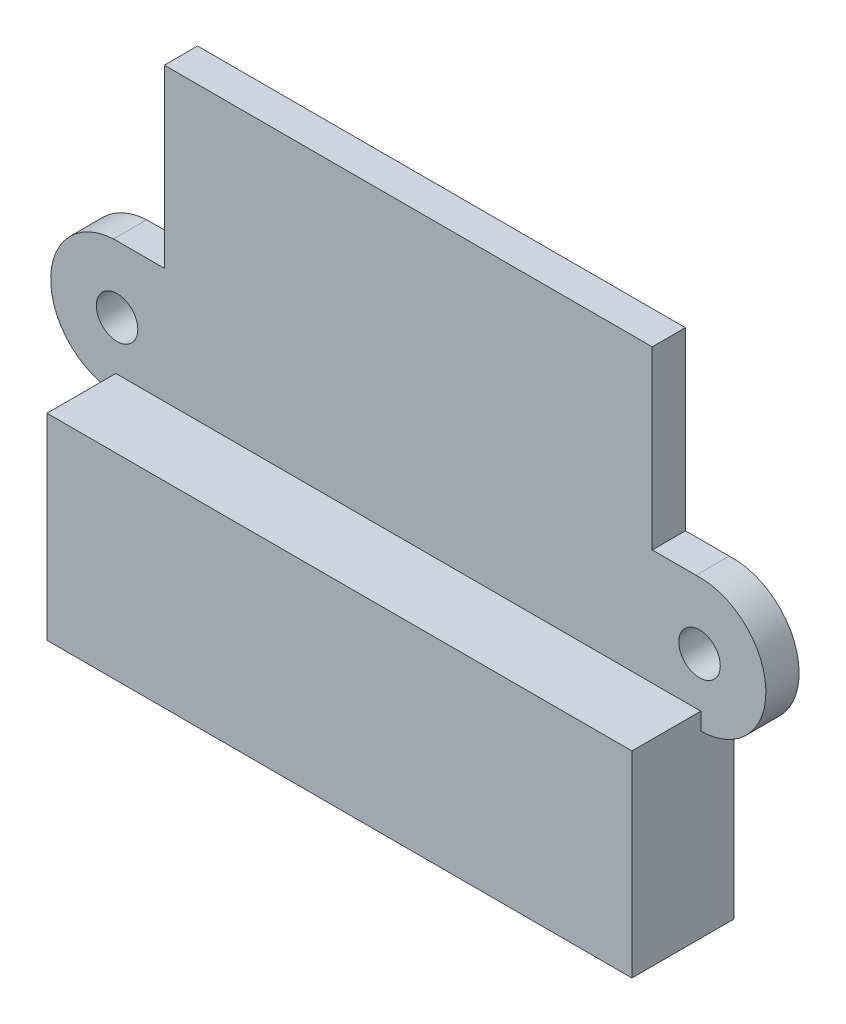
ISO-10303-21;
HEADER;
FILE_DESCRIPTION(('STEP AP214'),'2;1');
FILE_NAME('part.step','',(''),(''),'','','');
FILE_SCHEMA(('AUTOMOTIVE_DESIGN { 1 0 10303 214 1 1 1 1 }'));
ENDSEC;
DATA;
#1=APPLICATION_CONTEXT('core data for automotive mechanical design processes');
#2=APPLICATION_PROTOCOL_DEFINITION('international standard','automotive_design',2000,#1);
#3=PRODUCT_CONTEXT('',#1,'mechanical');
#4=PRODUCT('Part','Part','',(#3));
#5=PRODUCT_RELATED_PRODUCT_CATEGORY('part','',(#4));
#6=PRODUCT_DEFINITION_FORMATION('','',#4);
#7=PRODUCT_DEFINITION_CONTEXT('part definition',#1,'design');
#8=PRODUCT_DEFINITION('design','',#6,#7);
#9=PRODUCT_DEFINITION_SHAPE('','',#8);
#10=(LENGTH_UNIT() NAMED_UNIT(*) SI_UNIT(.MILLI.,.METRE.));
#11=(NAMED_UNIT(*) PLANE_ANGLE_UNIT() SI_UNIT($,.RADIAN.));
#12=(NAMED_UNIT(*) SI_UNIT($,.STERADIAN.) SOLID_ANGLE_UNIT());
#13=UNCERTAINTY_MEASURE_WITH_UNIT(LENGTH_MEASURE(1.E-05),#10,'distance_accuracy_value','');
#14=(GEOMETRIC_REPRESENTATION_CONTEXT(3) GLOBAL_UNCERTAINTY_ASSIGNED_CONTEXT((#13)) GLOBAL_UNIT_ASSIGNED_CONTEXT((#10,
#11,#12)) REPRESENTATION_CONTEXT('',''));
#15=CARTESIAN_POINT('',(0.,0.,0.));
#16=DIRECTION('',(0.,0.,1.));
#17=DIRECTION('',(1.,0.,0.));
#18=AXIS2_PLACEMENT_3D('',#15,#16,#17);
#19=CARTESIAN_POINT('',(8.9154,0.0536072783052845,1.016));
#20=DIRECTION('',(0.,0.,1.));
#21=DIRECTION('',(1.,0.,0.));
#22=AXIS2_PLACEMENT_3D('',#19,#20,#21);
#23=PLANE('',#22);
#24=DIRECTION('',(0.,-1.,0.));
#25=VECTOR('',#24,1.);
#26=CARTESIAN_POINT('',(-8.9535,-7.4676,1.016));
#27=LINE('',#26,#25);
#28=CARTESIAN_POINT('',(-8.9535,-1.4478,1.016));
#29=VERTEX_POINT('',#28);
#30=CARTESIAN_POINT('',(-8.9535,-1.97803550279577,1.016));
#31=VERTEX_POINT('',#30);
#32=EDGE_CURVE('E118',#29,#31,#27,.T.);
#33=ORIENTED_EDGE('',*,*,#32,.F.);
#34=DIRECTION('',(-1.,0.,0.));
#35=VECTOR('',#34,1.);
#36=CARTESIAN_POINT('',(-8.9535,-1.4478,1.016));
#37=LINE('',#36,#35);
#38=CARTESIAN_POINT('',(8.9535,-1.4478,1.016));
#39=VERTEX_POINT('',#38);
#40=EDGE_CURVE('E245',#39,#29,#37,.T.);
#41=ORIENTED_EDGE('',*,*,#40,.F.);
#42=DIRECTION('',(0.,1.,0.));
#43=VECTOR('',#42,1.);
#44=CARTESIAN_POINT('',(8.9535,-7.4676,1.016));
#45=LINE('',#44,#43);
#46=CARTESIAN_POINT('',(8.9535,-1.97803550279576,1.016));
#47=VERTEX_POINT('',#46);
#48=EDGE_CURVE('E12',#47,#39,#45,.T.);
#49=ORIENTED_EDGE('',*,*,#48,.F.);
#50=CARTESIAN_POINT('',(8.9154,0.0536072783052845,1.016));
#51=DIRECTION('',(0.,0.,1.));
#52=DIRECTION('',(1.,0.,0.));
#53=AXIS2_PLACEMENT_3D('',#50,#51,#52);
#54=CIRCLE('',#53,2.032);
#55=CARTESIAN_POINT('',(8.80862501125639,2.0828,1.016));
#56=VERTEX_POINT('',#55);
#57=EDGE_CURVE('E211',#47,#56,#54,.T.);
#58=ORIENTED_EDGE('',*,*,#57,.T.);
#59=DIRECTION('',(1.,0.,0.));
#60=VECTOR('',#59,1.);
#61=CARTESIAN_POINT('',(7.4676,2.0828,1.016));
#62=LINE('',#61,#60);
#63=CARTESIAN_POINT('',(7.4676,2.0828,1.016));
#64=VERTEX_POINT('',#63);
#65=EDGE_CURVE('E213',#64,#56,#62,.T.);
#66=ORIENTED_EDGE('',*,*,#65,.F.);
#67=DIRECTION('',(0.,-1.,0.));
#68=VECTOR('',#67,1.);
#69=CARTESIAN_POINT('',(7.4676,7.4676,1.016));
#70=LINE('',#69,#68);
#71=CARTESIAN_POINT('',(7.4676,7.4676,1.016));
#72=VERTEX_POINT('',#71);
#73=EDGE_CURVE('E263',#72,#64,#70,.T.);
#74=ORIENTED_EDGE('',*,*,#73,.F.);
#75=DIRECTION('',(1.,0.,0.));
#76=VECTOR('',#75,1.);
#77=CARTESIAN_POINT('',(-7.4676,7.4676,1.016));
#78=LINE('',#77,#76);
#79=CARTESIAN_POINT('',(-7.4676,7.4676,1.016));
#80=VERTEX_POINT('',#79);
#81=EDGE_CURVE('E261',#80,#72,#78,.T.);
#82=ORIENTED_EDGE('',*,*,#81,.F.);
#83=DIRECTION('',(0.,-1.,0.));
#84=VECTOR('',#83,1.);
#85=CARTESIAN_POINT('',(-7.4676,7.4676,1.016));
#86=LINE('',#85,#84);
#87=CARTESIAN_POINT('',(-7.4676,2.0828,1.016));
#88=VERTEX_POINT('',#87);
#89=EDGE_CURVE('E194',#80,#88,#86,.T.);
#90=ORIENTED_EDGE('',*,*,#89,.T.);
#91=DIRECTION('',(-1.,0.,0.));
#92=VECTOR('',#91,1.);
#93=CARTESIAN_POINT('',(-7.4676,2.0828,1.016));
#94=LINE('',#93,#92);
#95=CARTESIAN_POINT('',(-9.02217498874347,2.0828,1.016));
#96=VERTEX_POINT('',#95);
#97=EDGE_CURVE('E187',#88,#96,#94,.T.);
#98=ORIENTED_EDGE('',*,*,#97,.T.);
#99=CARTESIAN_POINT('',(-8.9154,0.0536072783052823,1.016));
#100=DIRECTION('',(0.,0.,1.));
#101=DIRECTION('',(1.,0.,0.));
#102=AXIS2_PLACEMENT_3D('',#99,#100,#101);
#103=CIRCLE('',#102,2.032);
#104=EDGE_CURVE('E191',#96,#31,#103,.T.);
#105=ORIENTED_EDGE('',*,*,#104,.T.);
#106=EDGE_LOOP('',(#33,#41,#49,#58,#66,#74,#82,#90,#98,#105));
#107=FACE_BOUND('',#106,.T.);
#108=CARTESIAN_POINT('',(-8.9154,0.0536072783052823,1.016));
#109=DIRECTION('',(0.,0.,1.));
#110=DIRECTION('',(1.,0.,0.));
#111=AXIS2_PLACEMENT_3D('',#108,#109,#110);
#112=CIRCLE('',#111,0.635000005703479);
#113=CARTESIAN_POINT('',(-8.28039999429652,0.0536072783052823,1.016));
#114=VERTEX_POINT('',#113);
#115=EDGE_CURVE('E255',#114,#114,#112,.T.);
#116=ORIENTED_EDGE('',*,*,#115,.F.);
#117=EDGE_LOOP('',(#116));
#118=FACE_BOUND('',#117,.T.);
#119=CARTESIAN_POINT('',(8.9154,0.0536072783052845,1.016));
#120=DIRECTION('',(0.,0.,1.));
#121=DIRECTION('',(1.,0.,0.));
#122=AXIS2_PLACEMENT_3D('',#119,#120,#121);
#123=CIRCLE('',#122,0.635000005703479);
#124=CARTESIAN_POINT('',(9.55040000570348,0.0536072783052845,1.016));
#125=VERTEX_POINT('',#124);
#126=EDGE_CURVE('E248',#125,#125,#123,.T.);
#127=ORIENTED_EDGE('',*,*,#126,.F.);
#128=EDGE_LOOP('',(#127));
#129=FACE_BOUND('',#128,.T.);
#130=ADVANCED_FACE('F101',(#107,#118,#129),#23,.T.);
#131=CARTESIAN_POINT('',(8.9154,0.0536072783052845,0.));
#132=DIRECTION('',(0.,0.,1.));
#133=DIRECTION('',(1.,0.,0.));
#134=AXIS2_PLACEMENT_3D('',#131,#132,#133);
#135=PLANE('',#134);
#136=CARTESIAN_POINT('',(-8.9154,0.0536072783052823,0.));
#137=DIRECTION('',(0.,0.,1.));
#138=DIRECTION('',(1.,0.,0.));
#139=AXIS2_PLACEMENT_3D('',#136,#137,#138);
#140=CIRCLE('',#139,0.635000005703479);
#141=CARTESIAN_POINT('',(-8.28039999429652,0.0536072783052823,0.));
#142=VERTEX_POINT('',#141);
#143=EDGE_CURVE('E251',#142,#142,#140,.T.);
#144=ORIENTED_EDGE('',*,*,#143,.T.);
#145=EDGE_LOOP('',(#144));
#146=FACE_BOUND('',#145,.T.);
#147=DIRECTION('',(1.,0.,0.));
#148=VECTOR('',#147,1.);
#149=CARTESIAN_POINT('',(-7.4676,7.4676,0.));
#150=LINE('',#149,#148);
#151=CARTESIAN_POINT('',(-7.4676,7.4676,0.));
#152=VERTEX_POINT('',#151);
#153=CARTESIAN_POINT('',(7.4676,7.4676,0.));
#154=VERTEX_POINT('',#153);
#155=EDGE_CURVE('E258',#152,#154,#150,.T.);
#156=ORIENTED_EDGE('',*,*,#155,.T.);
#157=DIRECTION('',(0.,-1.,0.));
#158=VECTOR('',#157,1.);
#159=CARTESIAN_POINT('',(7.4676,7.4676,0.));
#160=LINE('',#159,#158);
#161=CARTESIAN_POINT('',(7.4676,2.0828,0.));
#162=VERTEX_POINT('',#161);
#163=EDGE_CURVE('E271',#154,#162,#160,.T.);
#164=ORIENTED_EDGE('',*,*,#163,.T.);
#165=DIRECTION('',(1.,0.,0.));
#166=VECTOR('',#165,1.);
#167=CARTESIAN_POINT('',(7.4676,2.0828,0.));
#168=LINE('',#167,#166);
#169=CARTESIAN_POINT('',(8.80862501125639,2.0828,0.));
#170=VERTEX_POINT('',#169);
#171=EDGE_CURVE('E274',#162,#170,#168,.T.);
#172=ORIENTED_EDGE('',*,*,#171,.T.);
#173=CARTESIAN_POINT('',(8.9154,0.0536072783052845,0.));
#174=DIRECTION('',(0.,0.,1.));
#175=DIRECTION('',(1.,0.,0.));
#176=AXIS2_PLACEMENT_3D('',#173,#174,#175);
#177=CIRCLE('',#176,2.032);
#178=CARTESIAN_POINT('',(8.9535,-1.97803550279576,0.));
#179=VERTEX_POINT('',#178);
#180=EDGE_CURVE('E277',#179,#170,#177,.T.);
#181=ORIENTED_EDGE('',*,*,#180,.F.);
#182=DIRECTION('',(0.,-1.,0.));
#183=VECTOR('',#182,1.);
#184=CARTESIAN_POINT('',(8.9535,-1.97803550279576,0.));
#185=LINE('',#184,#183);
#186=CARTESIAN_POINT('',(8.9535,-7.4676,0.));
#187=VERTEX_POINT('',#186);
#188=EDGE_CURVE('E280',#179,#187,#185,.T.);
#189=ORIENTED_EDGE('',*,*,#188,.T.);
#190=DIRECTION('',(1.,0.,0.));
#191=VECTOR('',#190,1.);
#192=CARTESIAN_POINT('',(-8.9535,-7.4676,0.));
#193=LINE('',#192,#191);
#194=CARTESIAN_POINT('',(-8.9535,-7.4676,0.));
#195=VERTEX_POINT('',#194);
#196=EDGE_CURVE('E283',#195,#187,#193,.T.);
#197=ORIENTED_EDGE('',*,*,#196,.F.);
#198=DIRECTION('',(0.,-1.,0.));
#199=VECTOR('',#198,1.);
#200=CARTESIAN_POINT('',(-8.9535,-1.97803550279577,0.));
#201=LINE('',#200,#199);
#202=CARTESIAN_POINT('',(-8.9535,-1.97803550279577,0.));
#203=VERTEX_POINT('',#202);
#204=EDGE_CURVE('E285',#203,#195,#201,.T.);
#205=ORIENTED_EDGE('',*,*,#204,.F.);
#206=CARTESIAN_POINT('',(-8.9154,0.0536072783052823,0.));
#207=DIRECTION('',(0.,0.,1.));
#208=DIRECTION('',(1.,0.,0.));
#209=AXIS2_PLACEMENT_3D('',#206,#207,#208);
#210=CIRCLE('',#209,2.032);
#211=CARTESIAN_POINT('',(-9.02217498874347,2.0828,0.));
#212=VERTEX_POINT('',#211);
#213=EDGE_CURVE('E287',#212,#203,#210,.T.);
#214=ORIENTED_EDGE('',*,*,#213,.F.);
#215=DIRECTION('',(-1.,0.,0.));
#216=VECTOR('',#215,1.);
#217=CARTESIAN_POINT('',(-7.4676,2.0828,0.));
#218=LINE('',#217,#216);
#219=CARTESIAN_POINT('',(-7.4676,2.0828,0.));
#220=VERTEX_POINT('',#219);
#221=EDGE_CURVE('E203',#220,#212,#218,.T.);
#222=ORIENTED_EDGE('',*,*,#221,.F.);
#223=DIRECTION('',(0.,-1.,0.));
#224=VECTOR('',#223,1.);
#225=CARTESIAN_POINT('',(-7.4676,7.4676,0.));
#226=LINE('',#225,#224);
#227=EDGE_CURVE('E264',#152,#220,#226,.T.);
#228=ORIENTED_EDGE('',*,*,#227,.F.);
#229=EDGE_LOOP('',(#156,#164,#172,#181,#189,#197,#205,#214,#222,#228));
#230=FACE_BOUND('',#229,.T.);
#231=CARTESIAN_POINT('',(8.9154,0.0536072783052845,0.));
#232=DIRECTION('',(0.,0.,1.));
#233=DIRECTION('',(1.,0.,0.));
#234=AXIS2_PLACEMENT_3D('',#231,#232,#233);
#235=CIRCLE('',#234,0.635000005703479);
#236=CARTESIAN_POINT('',(9.55040000570348,0.0536072783052845,0.));
#237=VERTEX_POINT('',#236);
#238=EDGE_CURVE('E252',#237,#237,#235,.T.);
#239=ORIENTED_EDGE('',*,*,#238,.T.);
#240=EDGE_LOOP('',(#239));
#241=FACE_BOUND('',#240,.T.);
#242=ADVANCED_FACE('F292',(#146,#230,#241),#135,.F.);
#243=CARTESIAN_POINT('',(-7.4676,7.4676,1.016));
#244=DIRECTION('',(0.,1.,0.));
#245=DIRECTION('',(-1.,0.,0.));
#246=AXIS2_PLACEMENT_3D('',#243,#244,#245);
#247=PLANE('',#246);
#248=ORIENTED_EDGE('',*,*,#155,.F.);
#249=DIRECTION('',(0.,0.,-1.));
#250=VECTOR('',#249,1.);
#251=CARTESIAN_POINT('',(-7.4676,7.4676,1.016));
#252=LINE('',#251,#250);
#253=EDGE_CURVE('E110',#80,#152,#252,.T.);
#254=ORIENTED_EDGE('',*,*,#253,.F.);
#255=ORIENTED_EDGE('',*,*,#81,.T.);
#256=DIRECTION('',(0.,0.,-1.));
#257=VECTOR('',#256,1.);
#258=CARTESIAN_POINT('',(7.4676,7.4676,1.016));
#259=LINE('',#258,#257);
#260=EDGE_CURVE('E170',#72,#154,#259,.T.);
#261=ORIENTED_EDGE('',*,*,#260,.T.);
#262=EDGE_LOOP('',(#248,#254,#255,#261));
#263=FACE_BOUND('',#262,.T.);
#264=ADVANCED_FACE('F103',(#263),#247,.T.);
#265=CARTESIAN_POINT('',(-7.4676,7.4676,1.016));
#266=DIRECTION('',(1.,0.,0.));
#267=DIRECTION('',(0.,1.,0.));
#268=AXIS2_PLACEMENT_3D('',#265,#266,#267);
#269=PLANE('',#268);
#270=ORIENTED_EDGE('',*,*,#227,.T.);
#271=DIRECTION('',(0.,0.,-1.));
#272=VECTOR('',#271,1.);
#273=CARTESIAN_POINT('',(-7.4676,2.0828,1.016));
#274=LINE('',#273,#272);
#275=EDGE_CURVE('E206',#88,#220,#274,.T.);
#276=ORIENTED_EDGE('',*,*,#275,.F.);
#277=ORIENTED_EDGE('',*,*,#89,.F.);
#278=ORIENTED_EDGE('',*,*,#253,.T.);
#279=EDGE_LOOP('',(#270,#276,#277,#278));
#280=FACE_BOUND('',#279,.T.);
#281=ADVANCED_FACE('F343',(#280),#269,.F.);
#282=CARTESIAN_POINT('',(-7.4676,2.0828,1.016));
#283=DIRECTION('',(0.,-1.,0.));
#284=DIRECTION('',(1.,0.,0.));
#285=AXIS2_PLACEMENT_3D('',#282,#283,#284);
#286=PLANE('',#285);
#287=ORIENTED_EDGE('',*,*,#221,.T.);
#288=DIRECTION('',(0.,0.,-1.));
#289=VECTOR('',#288,1.);
#290=CARTESIAN_POINT('',(-9.02217498874347,2.0828,1.016));
#291=LINE('',#290,#289);
#292=EDGE_CURVE('E200',#96,#212,#291,.T.);
#293=ORIENTED_EDGE('',*,*,#292,.F.);
#294=ORIENTED_EDGE('',*,*,#97,.F.);
#295=ORIENTED_EDGE('',*,*,#275,.T.);
#296=EDGE_LOOP('',(#287,#293,#294,#295));
#297=FACE_BOUND('',#296,.T.);
#298=ADVANCED_FACE('F201',(#297),#286,.F.);
#299=CARTESIAN_POINT('',(-8.9154,0.0536072783052823,1.016));
#300=DIRECTION('',(0.,0.,-1.));
#301=DIRECTION('',(-1.,0.,0.));
#302=AXIS2_PLACEMENT_3D('',#299,#300,#301);
#303=CYLINDRICAL_SURFACE('',#302,2.032);
#304=ORIENTED_EDGE('',*,*,#213,.T.);
#305=DIRECTION('',(0.,0.,-1.));
#306=VECTOR('',#305,1.);
#307=CARTESIAN_POINT('',(-8.9535,-1.97803550279577,1.016));
#308=LINE('',#307,#306);
#309=EDGE_CURVE('E207',#31,#203,#308,.T.);
#310=ORIENTED_EDGE('',*,*,#309,.F.);
#311=ORIENTED_EDGE('',*,*,#104,.F.);
#312=ORIENTED_EDGE('',*,*,#292,.T.);
#313=EDGE_LOOP('',(#304,#310,#311,#312));
#314=FACE_BOUND('',#313,.T.);
#315=ADVANCED_FACE('F209',(#314),#303,.T.);
#316=CARTESIAN_POINT('',(-8.9535,-1.97803550279577,1.016));
#317=DIRECTION('',(1.,0.,0.));
#318=DIRECTION('',(0.,1.,0.));
#319=AXIS2_PLACEMENT_3D('',#316,#317,#318);
#320=PLANE('',#319);
#321=ORIENTED_EDGE('',*,*,#204,.T.);
#322=DIRECTION('',(0.,0.,-1.));
#323=VECTOR('',#322,1.);
#324=CARTESIAN_POINT('',(-8.9535,-7.4676,1.016));
#325=LINE('',#324,#323);
#326=CARTESIAN_POINT('',(-8.9535,-7.4676,3.1242));
#327=VERTEX_POINT('',#326);
#328=EDGE_CURVE('E219',#327,#195,#325,.T.);
#329=ORIENTED_EDGE('',*,*,#328,.F.);
#330=DIRECTION('',(0.,-1.,0.));
#331=VECTOR('',#330,1.);
#332=CARTESIAN_POINT('',(-8.9535,-7.4676,3.1242));
#333=LINE('',#332,#331);
#334=CARTESIAN_POINT('',(-8.9535,-1.4478,3.1242));
#335=VERTEX_POINT('',#334);
#336=EDGE_CURVE('E299',#335,#327,#333,.T.);
#337=ORIENTED_EDGE('',*,*,#336,.F.);
#338=DIRECTION('',(0.,0.,-1.));
#339=VECTOR('',#338,1.);
#340=CARTESIAN_POINT('',(-8.9535,-1.4478,3.1242));
#341=LINE('',#340,#339);
#342=EDGE_CURVE('E320',#335,#29,#341,.T.);
#343=ORIENTED_EDGE('',*,*,#342,.T.);
#344=ORIENTED_EDGE('',*,*,#32,.T.);
#345=ORIENTED_EDGE('',*,*,#309,.T.);
#346=EDGE_LOOP('',(#321,#329,#337,#343,#344,#345));
#347=FACE_BOUND('',#346,.T.);
#348=ADVANCED_FACE('F294',(#347),#320,.F.);
#349=CARTESIAN_POINT('',(-8.9535,-7.4676,1.016));
#350=DIRECTION('',(0.,1.,0.));
#351=DIRECTION('',(-1.,0.,0.));
#352=AXIS2_PLACEMENT_3D('',#349,#350,#351);
#353=PLANE('',#352);
#354=ORIENTED_EDGE('',*,*,#196,.T.);
#355=DIRECTION('',(0.,0.,-1.));
#356=VECTOR('',#355,1.);
#357=CARTESIAN_POINT('',(8.9535,-7.4676,1.016));
#358=LINE('',#357,#356);
#359=CARTESIAN_POINT('',(8.9535,-7.4676,3.1242));
#360=VERTEX_POINT('',#359);
#361=EDGE_CURVE('E223',#360,#187,#358,.T.);
#362=ORIENTED_EDGE('',*,*,#361,.F.);
#363=DIRECTION('',(1.,0.,0.));
#364=VECTOR('',#363,1.);
#365=CARTESIAN_POINT('',(-8.9535,-7.4676,3.1242));
#366=LINE('',#365,#364);
#367=EDGE_CURVE('E304',#327,#360,#366,.T.);
#368=ORIENTED_EDGE('',*,*,#367,.F.);
#369=ORIENTED_EDGE('',*,*,#328,.T.);
#370=EDGE_LOOP('',(#354,#362,#368,#369));
#371=FACE_BOUND('',#370,.T.);
#372=ADVANCED_FACE('F305',(#371),#353,.F.);
#373=CARTESIAN_POINT('',(8.9535,-1.97803550279576,1.016));
#374=DIRECTION('',(1.,0.,0.));
#375=DIRECTION('',(0.,1.,0.));
#376=AXIS2_PLACEMENT_3D('',#373,#374,#375);
#377=PLANE('',#376);
#378=ORIENTED_EDGE('',*,*,#188,.F.);
#379=DIRECTION('',(0.,0.,-1.));
#380=VECTOR('',#379,1.);
#381=CARTESIAN_POINT('',(8.9535,-1.97803550279576,1.016));
#382=LINE('',#381,#380);
#383=EDGE_CURVE('E230',#47,#179,#382,.T.);
#384=ORIENTED_EDGE('',*,*,#383,.F.);
#385=ORIENTED_EDGE('',*,*,#48,.T.);
#386=DIRECTION('',(0.,0.,-1.));
#387=VECTOR('',#386,1.);
#388=CARTESIAN_POINT('',(8.9535,-1.4478,3.1242));
#389=LINE('',#388,#387);
#390=CARTESIAN_POINT('',(8.9535,-1.4478,3.1242));
#391=VERTEX_POINT('',#390);
#392=EDGE_CURVE('E246',#391,#39,#389,.T.);
#393=ORIENTED_EDGE('',*,*,#392,.F.);
#394=DIRECTION('',(0.,1.,0.));
#395=VECTOR('',#394,1.);
#396=CARTESIAN_POINT('',(8.9535,-7.4676,3.1242));
#397=LINE('',#396,#395);
#398=EDGE_CURVE('E309',#360,#391,#397,.T.);
#399=ORIENTED_EDGE('',*,*,#398,.F.);
#400=ORIENTED_EDGE('',*,*,#361,.T.);
#401=EDGE_LOOP('',(#378,#384,#385,#393,#399,#400));
#402=FACE_BOUND('',#401,.T.);
#403=ADVANCED_FACE('F328',(#402),#377,.T.);
#404=CARTESIAN_POINT('',(8.9154,0.0536072783052845,1.016));
#405=DIRECTION('',(0.,0.,-1.));
#406=DIRECTION('',(-1.,0.,0.));
#407=AXIS2_PLACEMENT_3D('',#404,#405,#406);
#408=CYLINDRICAL_SURFACE('',#407,2.032);
#409=ORIENTED_EDGE('',*,*,#180,.T.);
#410=DIRECTION('',(0.,0.,-1.));
#411=VECTOR('',#410,1.);
#412=CARTESIAN_POINT('',(8.80862501125639,2.0828,1.016));
#413=LINE('',#412,#411);
#414=EDGE_CURVE('E234',#56,#170,#413,.T.);
#415=ORIENTED_EDGE('',*,*,#414,.F.);
#416=ORIENTED_EDGE('',*,*,#57,.F.);
#417=ORIENTED_EDGE('',*,*,#383,.T.);
#418=EDGE_LOOP('',(#409,#415,#416,#417));
#419=FACE_BOUND('',#418,.T.);
#420=ADVANCED_FACE('F336',(#419),#408,.T.);
#421=CARTESIAN_POINT('',(7.4676,2.0828,1.016));
#422=DIRECTION('',(0.,1.,0.));
#423=DIRECTION('',(-1.,0.,0.));
#424=AXIS2_PLACEMENT_3D('',#421,#422,#423);
#425=PLANE('',#424);
#426=ORIENTED_EDGE('',*,*,#171,.F.);
#427=DIRECTION('',(0.,0.,-1.));
#428=VECTOR('',#427,1.);
#429=CARTESIAN_POINT('',(7.4676,2.0828,1.016));
#430=LINE('',#429,#428);
#431=EDGE_CURVE('E236',#64,#162,#430,.T.);
#432=ORIENTED_EDGE('',*,*,#431,.F.);
#433=ORIENTED_EDGE('',*,*,#65,.T.);
#434=ORIENTED_EDGE('',*,*,#414,.T.);
#435=EDGE_LOOP('',(#426,#432,#433,#434));
#436=FACE_BOUND('',#435,.T.);
#437=ADVANCED_FACE('F340',(#436),#425,.T.);
#438=CARTESIAN_POINT('',(7.4676,7.4676,1.016));
#439=DIRECTION('',(1.,0.,0.));
#440=DIRECTION('',(0.,1.,0.));
#441=AXIS2_PLACEMENT_3D('',#438,#439,#440);
#442=PLANE('',#441);
#443=ORIENTED_EDGE('',*,*,#163,.F.);
#444=ORIENTED_EDGE('',*,*,#260,.F.);
#445=ORIENTED_EDGE('',*,*,#73,.T.);
#446=ORIENTED_EDGE('',*,*,#431,.T.);
#447=EDGE_LOOP('',(#443,#444,#445,#446));
#448=FACE_BOUND('',#447,.T.);
#449=ADVANCED_FACE('F341',(#448),#442,.T.);
#450=CARTESIAN_POINT('',(-8.9154,0.0536072783052823,1.016));
#451=DIRECTION('',(0.,0.,-1.));
#452=DIRECTION('',(-1.,0.,0.));
#453=AXIS2_PLACEMENT_3D('',#450,#451,#452);
#454=CYLINDRICAL_SURFACE('',#453,0.635000005703479);
#455=ORIENTED_EDGE('',*,*,#115,.T.);
#456=EDGE_LOOP('',(#455));
#457=FACE_BOUND('',#456,.T.);
#458=ORIENTED_EDGE('',*,*,#143,.F.);
#459=EDGE_LOOP('',(#458));
#460=FACE_BOUND('',#459,.T.);
#461=ADVANCED_FACE('F356',(#457,#460),#454,.F.);
#462=CARTESIAN_POINT('',(8.9154,0.0536072783052845,1.016));
#463=DIRECTION('',(0.,0.,-1.));
#464=DIRECTION('',(-1.,0.,0.));
#465=AXIS2_PLACEMENT_3D('',#462,#463,#464);
#466=CYLINDRICAL_SURFACE('',#465,0.635000005703479);
#467=ORIENTED_EDGE('',*,*,#126,.T.);
#468=EDGE_LOOP('',(#467));
#469=FACE_BOUND('',#468,.T.);
#470=ORIENTED_EDGE('',*,*,#238,.F.);
#471=EDGE_LOOP('',(#470));
#472=FACE_BOUND('',#471,.T.);
#473=ADVANCED_FACE('F376',(#469,#472),#466,.F.);
#474=CARTESIAN_POINT('',(-8.9535,-1.4478,3.1242));
#475=DIRECTION('',(0.,-1.,0.));
#476=DIRECTION('',(0.,0.,-1.));
#477=AXIS2_PLACEMENT_3D('',#474,#475,#476);
#478=PLANE('',#477);
#479=ORIENTED_EDGE('',*,*,#40,.T.);
#480=ORIENTED_EDGE('',*,*,#342,.F.);
#481=DIRECTION('',(-1.,0.,0.));
#482=VECTOR('',#481,1.);
#483=CARTESIAN_POINT('',(-8.9535,-1.4478,3.1242));
#484=LINE('',#483,#482);
#485=EDGE_CURVE('E314',#391,#335,#484,.T.);
#486=ORIENTED_EDGE('',*,*,#485,.F.);
#487=ORIENTED_EDGE('',*,*,#392,.T.);
#488=EDGE_LOOP('',(#479,#480,#486,#487));
#489=FACE_BOUND('',#488,.T.);
#490=ADVANCED_FACE('F324',(#489),#478,.F.);
#491=CARTESIAN_POINT('',(0.,0.,3.1242));
#492=DIRECTION('',(0.,0.,-1.));
#493=DIRECTION('',(-1.,0.,0.));
#494=AXIS2_PLACEMENT_3D('',#491,#492,#493);
#495=PLANE('',#494);
#496=ORIENTED_EDGE('',*,*,#336,.T.);
#497=ORIENTED_EDGE('',*,*,#367,.T.);
#498=ORIENTED_EDGE('',*,*,#398,.T.);
#499=ORIENTED_EDGE('',*,*,#485,.T.);
#500=EDGE_LOOP('',(#496,#497,#498,#499));
#501=FACE_BOUND('',#500,.T.);
#502=ADVANCED_FACE('F312',(#501),#495,.F.);
#503=CLOSED_SHELL('',(#130,#242,#264,#281,#298,#315,#348,#372,#403,#420,#437,#449,#461,#473,
#490,#502));
#504=MANIFOLD_SOLID_BREP('B2',#503);
#505=ADVANCED_BREP_SHAPE_REPRESENTATION('',(#18,#504),#14);
#506=SHAPE_DEFINITION_REPRESENTATION(#9,#505);
ENDSEC;
END-ISO-10303-21;
